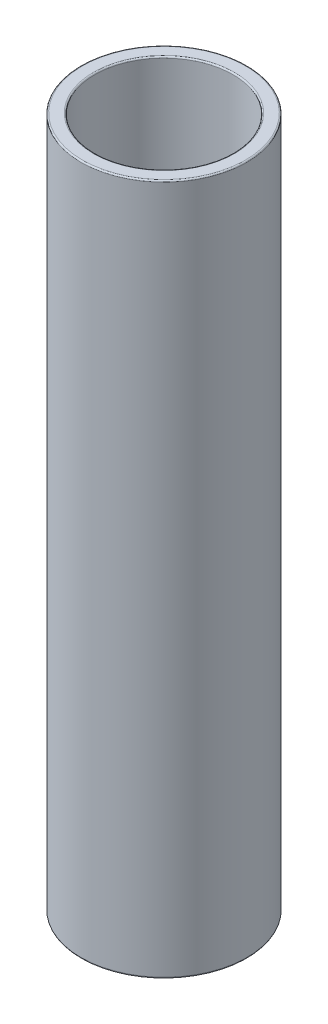
ISO-10303-21;
HEADER;
FILE_DESCRIPTION(('STEP AP214'),'2;1');
FILE_NAME('part.step','',(''),(''),'','','');
FILE_SCHEMA(('AUTOMOTIVE_DESIGN { 1 0 10303 214 1 1 1 1 }'));
ENDSEC;
DATA;
#1=APPLICATION_CONTEXT('core data for automotive mechanical design processes');
#2=APPLICATION_PROTOCOL_DEFINITION('international standard','automotive_design',2000,#1);
#3=PRODUCT_CONTEXT('',#1,'mechanical');
#4=PRODUCT('Part','Part','',(#3));
#5=PRODUCT_RELATED_PRODUCT_CATEGORY('part','',(#4));
#6=PRODUCT_DEFINITION_FORMATION('','',#4);
#7=PRODUCT_DEFINITION_CONTEXT('part definition',#1,'design');
#8=PRODUCT_DEFINITION('design','',#6,#7);
#9=PRODUCT_DEFINITION_SHAPE('','',#8);
#10=(LENGTH_UNIT() NAMED_UNIT(*) SI_UNIT(.MILLI.,.METRE.));
#11=(NAMED_UNIT(*) PLANE_ANGLE_UNIT() SI_UNIT($,.RADIAN.));
#12=(NAMED_UNIT(*) SI_UNIT($,.STERADIAN.) SOLID_ANGLE_UNIT());
#13=UNCERTAINTY_MEASURE_WITH_UNIT(LENGTH_MEASURE(1.E-05),#10,'distance_accuracy_value','');
#14=(GEOMETRIC_REPRESENTATION_CONTEXT(3) GLOBAL_UNCERTAINTY_ASSIGNED_CONTEXT((#13)) GLOBAL_UNIT_ASSIGNED_CONTEXT((#10,
#11,#12)) REPRESENTATION_CONTEXT('',''));
#15=CARTESIAN_POINT('',(0.,0.,0.));
#16=DIRECTION('',(0.,0.,1.));
#17=DIRECTION('',(1.,0.,0.));
#18=AXIS2_PLACEMENT_3D('',#15,#16,#17);
#19=CARTESIAN_POINT('',(0.,12.5,0.));
#20=DIRECTION('',(0.,1.,0.));
#21=DIRECTION('',(0.,0.,1.));
#22=AXIS2_PLACEMENT_3D('',#19,#20,#21);
#23=PLANE('',#22);
#24=CARTESIAN_POINT('',(0.,12.5,0.));
#25=DIRECTION('',(0.,1.,0.));
#26=DIRECTION('',(0.,0.,1.));
#27=AXIS2_PLACEMENT_3D('',#24,#25,#26);
#28=CIRCLE('',#27,2.55);
#29=CARTESIAN_POINT('',(0.,12.5,2.55));
#30=VERTEX_POINT('',#29);
#31=EDGE_CURVE('E10',#30,#30,#28,.F.);
#32=ORIENTED_EDGE('',*,*,#31,.T.);
#33=EDGE_LOOP('',(#32));
#34=FACE_BOUND('',#33,.T.);
#35=CARTESIAN_POINT('',(0.,12.5,0.));
#36=DIRECTION('',(0.,1.,0.));
#37=DIRECTION('',(0.,0.,1.));
#38=AXIS2_PLACEMENT_3D('',#35,#36,#37);
#39=CIRCLE('',#38,2.95);
#40=CARTESIAN_POINT('',(0.,12.5,2.95));
#41=VERTEX_POINT('',#40);
#42=EDGE_CURVE('E38',#41,#41,#39,.T.);
#43=ORIENTED_EDGE('',*,*,#42,.T.);
#44=EDGE_LOOP('',(#43));
#45=FACE_BOUND('',#44,.T.);
#46=ADVANCED_FACE('F31',(#34,#45),#23,.T.);
#47=CARTESIAN_POINT('',(0.,-12.5,0.));
#48=DIRECTION('',(0.,1.,0.));
#49=DIRECTION('',(0.,0.,1.));
#50=AXIS2_PLACEMENT_3D('',#47,#48,#49);
#51=PLANE('',#50);
#52=CARTESIAN_POINT('',(0.,-12.5,0.));
#53=DIRECTION('',(0.,1.,0.));
#54=DIRECTION('',(0.,0.,1.));
#55=AXIS2_PLACEMENT_3D('',#52,#53,#54);
#56=CIRCLE('',#55,2.55);
#57=CARTESIAN_POINT('',(0.,-12.5,2.55));
#58=VERTEX_POINT('',#57);
#59=EDGE_CURVE('E57',#58,#58,#56,.T.);
#60=ORIENTED_EDGE('',*,*,#59,.T.);
#61=EDGE_LOOP('',(#60));
#62=FACE_BOUND('',#61,.T.);
#63=CARTESIAN_POINT('',(0.,-12.5,0.));
#64=DIRECTION('',(0.,1.,0.));
#65=DIRECTION('',(0.,0.,1.));
#66=AXIS2_PLACEMENT_3D('',#63,#64,#65);
#67=CIRCLE('',#66,2.95);
#68=CARTESIAN_POINT('',(0.,-12.5,2.95));
#69=VERTEX_POINT('',#68);
#70=EDGE_CURVE('E60',#69,#69,#67,.F.);
#71=ORIENTED_EDGE('',*,*,#70,.T.);
#72=EDGE_LOOP('',(#71));
#73=FACE_BOUND('',#72,.T.);
#74=ADVANCED_FACE('F64',(#62,#73),#51,.F.);
#75=CARTESIAN_POINT('',(0.,12.5,0.));
#76=DIRECTION('',(0.,-1.,0.));
#77=DIRECTION('',(0.,0.,-1.));
#78=AXIS2_PLACEMENT_3D('',#75,#76,#77);
#79=CYLINDRICAL_SURFACE('',#78,3.);
#80=CARTESIAN_POINT('',(0.,-12.45,0.));
#81=DIRECTION('',(0.,1.,0.));
#82=DIRECTION('',(0.,0.,1.));
#83=AXIS2_PLACEMENT_3D('',#80,#81,#82);
#84=CIRCLE('',#83,3.);
#85=CARTESIAN_POINT('',(0.,-12.45,3.));
#86=VERTEX_POINT('',#85);
#87=EDGE_CURVE('E42',#86,#86,#84,.T.);
#88=ORIENTED_EDGE('',*,*,#87,.T.);
#89=EDGE_LOOP('',(#88));
#90=FACE_BOUND('',#89,.T.);
#91=CARTESIAN_POINT('',(0.,12.45,0.));
#92=DIRECTION('',(0.,1.,0.));
#93=DIRECTION('',(0.,0.,1.));
#94=AXIS2_PLACEMENT_3D('',#91,#92,#93);
#95=CIRCLE('',#94,3.);
#96=CARTESIAN_POINT('',(0.,12.45,3.));
#97=VERTEX_POINT('',#96);
#98=EDGE_CURVE('E46',#97,#97,#95,.F.);
#99=ORIENTED_EDGE('',*,*,#98,.T.);
#100=EDGE_LOOP('',(#99));
#101=FACE_BOUND('',#100,.T.);
#102=ADVANCED_FACE('F74',(#90,#101),#79,.T.);
#103=CARTESIAN_POINT('',(0.,12.5,0.));
#104=DIRECTION('',(0.,-1.,0.));
#105=DIRECTION('',(0.,0.,-1.));
#106=AXIS2_PLACEMENT_3D('',#103,#104,#105);
#107=CYLINDRICAL_SURFACE('',#106,2.5);
#108=CARTESIAN_POINT('',(0.,-12.45,0.));
#109=DIRECTION('',(0.,1.,0.));
#110=DIRECTION('',(0.,0.,1.));
#111=AXIS2_PLACEMENT_3D('',#108,#109,#110);
#112=CIRCLE('',#111,2.5);
#113=CARTESIAN_POINT('',(0.,-12.45,2.5));
#114=VERTEX_POINT('',#113);
#115=EDGE_CURVE('E51',#114,#114,#112,.F.);
#116=ORIENTED_EDGE('',*,*,#115,.T.);
#117=EDGE_LOOP('',(#116));
#118=FACE_BOUND('',#117,.T.);
#119=CARTESIAN_POINT('',(0.,12.45,0.));
#120=DIRECTION('',(0.,1.,0.));
#121=DIRECTION('',(0.,0.,1.));
#122=AXIS2_PLACEMENT_3D('',#119,#120,#121);
#123=CIRCLE('',#122,2.5);
#124=CARTESIAN_POINT('',(0.,12.45,2.5));
#125=VERTEX_POINT('',#124);
#126=EDGE_CURVE('E54',#125,#125,#123,.T.);
#127=ORIENTED_EDGE('',*,*,#126,.T.);
#128=EDGE_LOOP('',(#127));
#129=FACE_BOUND('',#128,.T.);
#130=ADVANCED_FACE('F77',(#118,#129),#107,.F.);
#131=CARTESIAN_POINT('',(0.,-12.45,0.));
#132=DIRECTION('',(0.,1.,0.));
#133=DIRECTION('',(0.,0.,1.));
#134=AXIS2_PLACEMENT_3D('',#131,#132,#133);
#135=TOROIDAL_SURFACE('',#134,2.55,0.05);
#136=ORIENTED_EDGE('',*,*,#115,.F.);
#137=EDGE_LOOP('',(#136));
#138=FACE_BOUND('',#137,.T.);
#139=ORIENTED_EDGE('',*,*,#59,.F.);
#140=EDGE_LOOP('',(#139));
#141=FACE_BOUND('',#140,.T.);
#142=ADVANCED_FACE('F70',(#138,#141),#135,.T.);
#143=CARTESIAN_POINT('',(0.,-12.45,0.));
#144=DIRECTION('',(0.,1.,0.));
#145=DIRECTION('',(0.,0.,1.));
#146=AXIS2_PLACEMENT_3D('',#143,#144,#145);
#147=TOROIDAL_SURFACE('',#146,2.95,0.05);
#148=ORIENTED_EDGE('',*,*,#70,.F.);
#149=EDGE_LOOP('',(#148));
#150=FACE_BOUND('',#149,.T.);
#151=ORIENTED_EDGE('',*,*,#87,.F.);
#152=EDGE_LOOP('',(#151));
#153=FACE_BOUND('',#152,.T.);
#154=ADVANCED_FACE('F66',(#150,#153),#147,.T.);
#155=CARTESIAN_POINT('',(0.,12.45,0.));
#156=DIRECTION('',(0.,1.,0.));
#157=DIRECTION('',(0.,0.,1.));
#158=AXIS2_PLACEMENT_3D('',#155,#156,#157);
#159=TOROIDAL_SURFACE('',#158,2.55,0.05);
#160=ORIENTED_EDGE('',*,*,#31,.F.);
#161=EDGE_LOOP('',(#160));
#162=FACE_BOUND('',#161,.T.);
#163=ORIENTED_EDGE('',*,*,#126,.F.);
#164=EDGE_LOOP('',(#163));
#165=FACE_BOUND('',#164,.T.);
#166=ADVANCED_FACE('F69',(#162,#165),#159,.T.);
#167=CARTESIAN_POINT('',(0.,12.45,0.));
#168=DIRECTION('',(0.,1.,0.));
#169=DIRECTION('',(0.,0.,1.));
#170=AXIS2_PLACEMENT_3D('',#167,#168,#169);
#171=TOROIDAL_SURFACE('',#170,2.95,0.05);
#172=ORIENTED_EDGE('',*,*,#98,.F.);
#173=EDGE_LOOP('',(#172));
#174=FACE_BOUND('',#173,.T.);
#175=ORIENTED_EDGE('',*,*,#42,.F.);
#176=EDGE_LOOP('',(#175));
#177=FACE_BOUND('',#176,.T.);
#178=ADVANCED_FACE('F33',(#174,#177),#171,.T.);
#179=CLOSED_SHELL('',(#46,#74,#102,#130,#142,#154,#166,#178));
#180=MANIFOLD_SOLID_BREP('B2',#179);
#181=ADVANCED_BREP_SHAPE_REPRESENTATION('',(#18,#180),#14);
#182=SHAPE_DEFINITION_REPRESENTATION(#9,#181);
ENDSEC;
END-ISO-10303-21;
